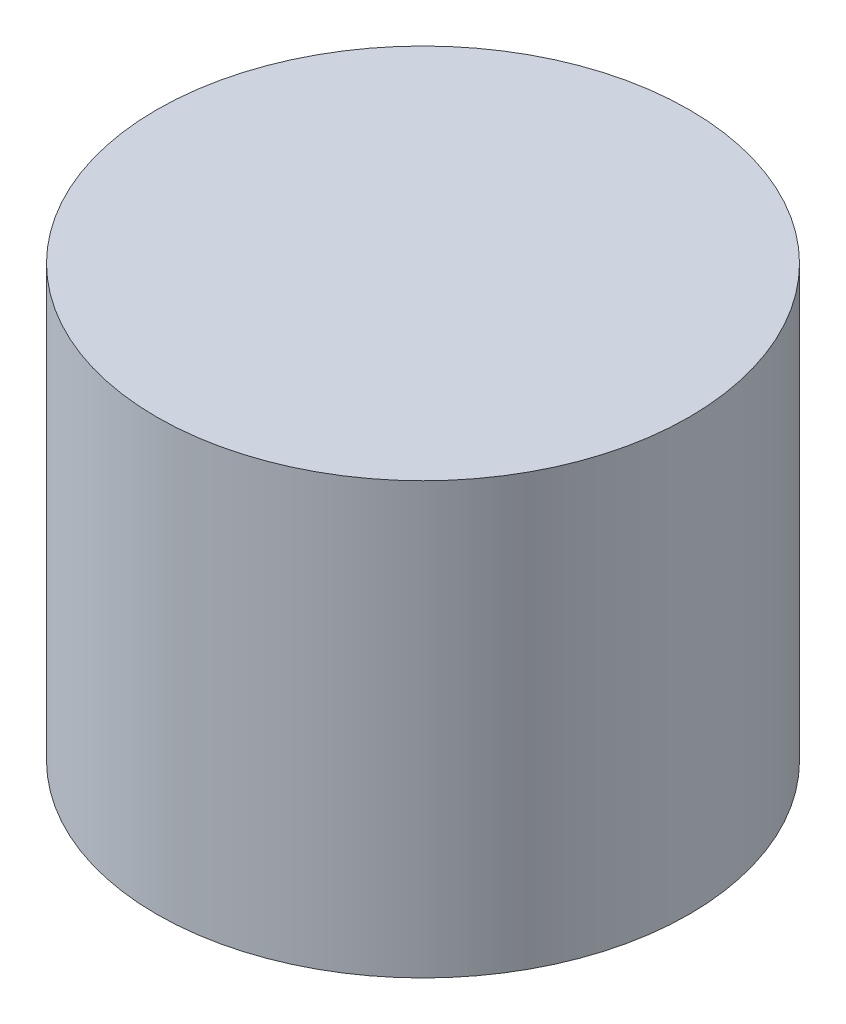
ISO-10303-21;
HEADER;
FILE_DESCRIPTION(('STEP AP214'),'2;1');
FILE_NAME('part.step','',(''),(''),'','','');
FILE_SCHEMA(('AUTOMOTIVE_DESIGN { 1 0 10303 214 1 1 1 1 }'));
ENDSEC;
DATA;
#1=APPLICATION_CONTEXT('core data for automotive mechanical design processes');
#2=APPLICATION_PROTOCOL_DEFINITION('international standard','automotive_design',2000,#1);
#3=PRODUCT_CONTEXT('',#1,'mechanical');
#4=PRODUCT('Part','Part','',(#3));
#5=PRODUCT_RELATED_PRODUCT_CATEGORY('part','',(#4));
#6=PRODUCT_DEFINITION_FORMATION('','',#4);
#7=PRODUCT_DEFINITION_CONTEXT('part definition',#1,'design');
#8=PRODUCT_DEFINITION('design','',#6,#7);
#9=PRODUCT_DEFINITION_SHAPE('','',#8);
#10=(LENGTH_UNIT() NAMED_UNIT(*) SI_UNIT(.MILLI.,.METRE.));
#11=(NAMED_UNIT(*) PLANE_ANGLE_UNIT() SI_UNIT($,.RADIAN.));
#12=(NAMED_UNIT(*) SI_UNIT($,.STERADIAN.) SOLID_ANGLE_UNIT());
#13=UNCERTAINTY_MEASURE_WITH_UNIT(LENGTH_MEASURE(1.E-05),#10,'distance_accuracy_value','');
#14=(GEOMETRIC_REPRESENTATION_CONTEXT(3) GLOBAL_UNCERTAINTY_ASSIGNED_CONTEXT((#13)) GLOBAL_UNIT_ASSIGNED_CONTEXT((#10,
#11,#12)) REPRESENTATION_CONTEXT('',''));
#15=CARTESIAN_POINT('',(0.,0.,0.));
#16=DIRECTION('',(0.,0.,1.));
#17=DIRECTION('',(1.,0.,0.));
#18=AXIS2_PLACEMENT_3D('',#15,#16,#17);
#19=CARTESIAN_POINT('',(0.,-18.6,0.));
#20=DIRECTION('',(0.,1.,0.));
#21=DIRECTION('',(0.,0.,1.));
#22=AXIS2_PLACEMENT_3D('',#19,#20,#21);
#23=CYLINDRICAL_SURFACE('',#22,11.5);
#24=CARTESIAN_POINT('',(0.,-18.6,0.));
#25=DIRECTION('',(0.,1.,0.));
#26=DIRECTION('',(0.,0.,1.));
#27=AXIS2_PLACEMENT_3D('',#24,#25,#26);
#28=CIRCLE('',#27,11.5);
#29=CARTESIAN_POINT('',(0.,-18.6,11.5));
#30=VERTEX_POINT('',#29);
#31=EDGE_CURVE('E10',#30,#30,#28,.T.);
#32=ORIENTED_EDGE('',*,*,#31,.T.);
#33=EDGE_LOOP('',(#32));
#34=FACE_BOUND('',#33,.T.);
#35=CARTESIAN_POINT('',(0.,0.,0.));
#36=DIRECTION('',(0.,1.,0.));
#37=DIRECTION('',(0.,0.,1.));
#38=AXIS2_PLACEMENT_3D('',#35,#36,#37);
#39=CIRCLE('',#38,11.5);
#40=CARTESIAN_POINT('',(0.,0.,11.5));
#41=VERTEX_POINT('',#40);
#42=EDGE_CURVE('E40',#41,#41,#39,.T.);
#43=ORIENTED_EDGE('',*,*,#42,.F.);
#44=EDGE_LOOP('',(#43));
#45=FACE_BOUND('',#44,.T.);
#46=ADVANCED_FACE('F37',(#34,#45),#23,.T.);
#47=CARTESIAN_POINT('',(0.,-18.6,0.));
#48=DIRECTION('',(0.,1.,0.));
#49=DIRECTION('',(0.,0.,1.));
#50=AXIS2_PLACEMENT_3D('',#47,#48,#49);
#51=PLANE('',#50);
#52=ORIENTED_EDGE('',*,*,#31,.F.);
#53=EDGE_LOOP('',(#52));
#54=FACE_BOUND('',#53,.T.);
#55=ADVANCED_FACE('F54',(#54),#51,.F.);
#56=CARTESIAN_POINT('',(0.,0.,0.));
#57=DIRECTION('',(0.,1.,0.));
#58=DIRECTION('',(0.,0.,1.));
#59=AXIS2_PLACEMENT_3D('',#56,#57,#58);
#60=PLANE('',#59);
#61=ORIENTED_EDGE('',*,*,#42,.T.);
#62=EDGE_LOOP('',(#61));
#63=FACE_BOUND('',#62,.T.);
#64=ADVANCED_FACE('F51',(#63),#60,.T.);
#65=CLOSED_SHELL('',(#46,#55,#64));
#66=MANIFOLD_SOLID_BREP('B2',#65);
#67=ADVANCED_BREP_SHAPE_REPRESENTATION('',(#18,#66),#14);
#68=SHAPE_DEFINITION_REPRESENTATION(#9,#67);
ENDSEC;
END-ISO-10303-21;
